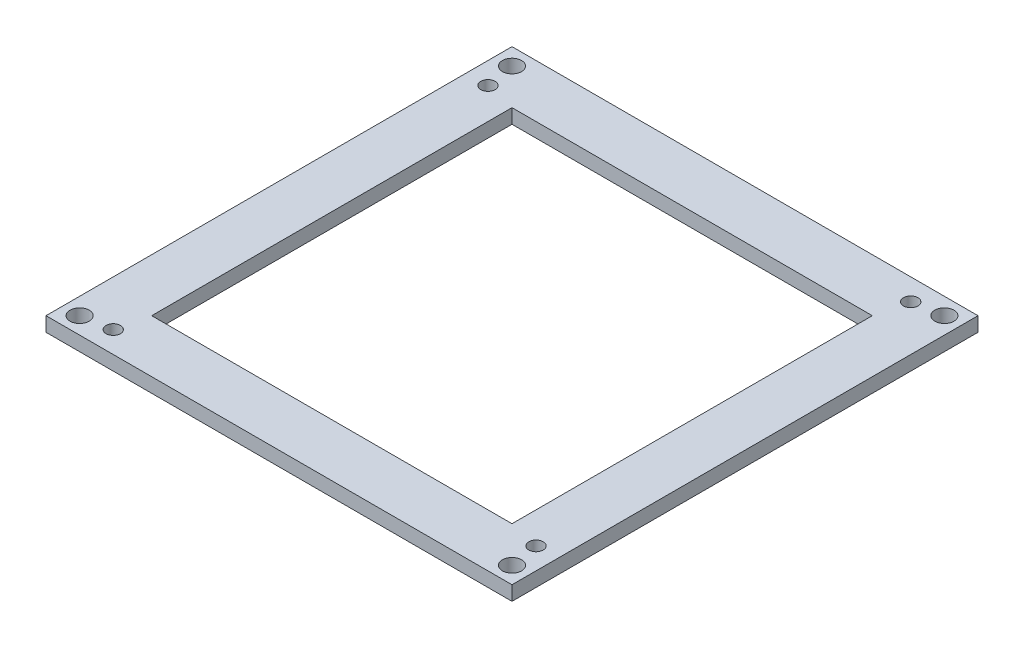
ISO-10303-21;
HEADER;
FILE_DESCRIPTION(('STEP AP214'),'2;1');
FILE_NAME('part.step','',(''),(''),'','','');
FILE_SCHEMA(('AUTOMOTIVE_DESIGN { 1 0 10303 214 1 1 1 1 }'));
ENDSEC;
DATA;
#1=APPLICATION_CONTEXT('core data for automotive mechanical design processes');
#2=APPLICATION_PROTOCOL_DEFINITION('international standard','automotive_design',2000,#1);
#3=PRODUCT_CONTEXT('',#1,'mechanical');
#4=PRODUCT('Part','Part','',(#3));
#5=PRODUCT_RELATED_PRODUCT_CATEGORY('part','',(#4));
#6=PRODUCT_DEFINITION_FORMATION('','',#4);
#7=PRODUCT_DEFINITION_CONTEXT('part definition',#1,'design');
#8=PRODUCT_DEFINITION('design','',#6,#7);
#9=PRODUCT_DEFINITION_SHAPE('','',#8);
#10=(LENGTH_UNIT() NAMED_UNIT(*) SI_UNIT(.MILLI.,.METRE.));
#11=(NAMED_UNIT(*) PLANE_ANGLE_UNIT() SI_UNIT($,.RADIAN.));
#12=(NAMED_UNIT(*) SI_UNIT($,.STERADIAN.) SOLID_ANGLE_UNIT());
#13=UNCERTAINTY_MEASURE_WITH_UNIT(LENGTH_MEASURE(1.E-05),#10,'distance_accuracy_value','');
#14=(GEOMETRIC_REPRESENTATION_CONTEXT(3) GLOBAL_UNCERTAINTY_ASSIGNED_CONTEXT((#13)) GLOBAL_UNIT_ASSIGNED_CONTEXT((#10,
#11,#12)) REPRESENTATION_CONTEXT('',''));
#15=CARTESIAN_POINT('',(0.,0.,0.));
#16=DIRECTION('',(0.,0.,1.));
#17=DIRECTION('',(1.,0.,0.));
#18=AXIS2_PLACEMENT_3D('',#15,#16,#17);
#19=CARTESIAN_POINT('',(0.,3.,0.));
#20=DIRECTION('',(1.,0.,0.));
#21=DIRECTION('',(0.,0.,-1.));
#22=AXIS2_PLACEMENT_3D('',#19,#20,#21);
#23=PLANE('',#22);
#24=DIRECTION('',(0.,0.,1.));
#25=VECTOR('',#24,1.);
#26=CARTESIAN_POINT('',(0.,0.,0.));
#27=LINE('',#26,#25);
#28=CARTESIAN_POINT('',(0.,0.,-97.));
#29=VERTEX_POINT('',#28);
#30=CARTESIAN_POINT('',(0.,0.,0.));
#31=VERTEX_POINT('',#30);
#32=EDGE_CURVE('E132',#29,#31,#27,.T.);
#33=ORIENTED_EDGE('',*,*,#32,.T.);
#34=DIRECTION('',(0.,-1.,0.));
#35=VECTOR('',#34,1.);
#36=CARTESIAN_POINT('',(0.,3.,0.));
#37=LINE('',#36,#35);
#38=CARTESIAN_POINT('',(0.,3.,0.));
#39=VERTEX_POINT('',#38);
#40=EDGE_CURVE('E179',#39,#31,#37,.T.);
#41=ORIENTED_EDGE('',*,*,#40,.F.);
#42=DIRECTION('',(0.,0.,1.));
#43=VECTOR('',#42,1.);
#44=CARTESIAN_POINT('',(0.,3.,0.));
#45=LINE('',#44,#43);
#46=CARTESIAN_POINT('',(0.,3.,-97.));
#47=VERTEX_POINT('',#46);
#48=EDGE_CURVE('E153',#47,#39,#45,.T.);
#49=ORIENTED_EDGE('',*,*,#48,.F.);
#50=DIRECTION('',(0.,-1.,0.));
#51=VECTOR('',#50,1.);
#52=CARTESIAN_POINT('',(0.,3.,-97.));
#53=LINE('',#52,#51);
#54=EDGE_CURVE('E163',#47,#29,#53,.T.);
#55=ORIENTED_EDGE('',*,*,#54,.T.);
#56=EDGE_LOOP('',(#33,#41,#49,#55));
#57=FACE_BOUND('',#56,.T.);
#58=ADVANCED_FACE('F35',(#57),#23,.F.);
#59=CARTESIAN_POINT('',(0.,3.,0.));
#60=DIRECTION('',(0.,0.,-1.));
#61=DIRECTION('',(-1.,0.,0.));
#62=AXIS2_PLACEMENT_3D('',#59,#60,#61);
#63=PLANE('',#62);
#64=DIRECTION('',(1.,0.,0.));
#65=VECTOR('',#64,1.);
#66=CARTESIAN_POINT('',(0.,0.,0.));
#67=LINE('',#66,#65);
#68=CARTESIAN_POINT('',(97.,0.,0.));
#69=VERTEX_POINT('',#68);
#70=EDGE_CURVE('E166',#31,#69,#67,.T.);
#71=ORIENTED_EDGE('',*,*,#70,.T.);
#72=DIRECTION('',(0.,-1.,0.));
#73=VECTOR('',#72,1.);
#74=CARTESIAN_POINT('',(97.,3.,0.));
#75=LINE('',#74,#73);
#76=CARTESIAN_POINT('',(97.,3.,0.));
#77=VERTEX_POINT('',#76);
#78=EDGE_CURVE('E176',#77,#69,#75,.T.);
#79=ORIENTED_EDGE('',*,*,#78,.F.);
#80=DIRECTION('',(1.,0.,0.));
#81=VECTOR('',#80,1.);
#82=CARTESIAN_POINT('',(0.,3.,0.));
#83=LINE('',#82,#81);
#84=EDGE_CURVE('E156',#39,#77,#83,.T.);
#85=ORIENTED_EDGE('',*,*,#84,.F.);
#86=ORIENTED_EDGE('',*,*,#40,.T.);
#87=EDGE_LOOP('',(#71,#79,#85,#86));
#88=FACE_BOUND('',#87,.T.);
#89=ADVANCED_FACE('F237',(#88),#63,.F.);
#90=CARTESIAN_POINT('',(97.,3.,0.));
#91=DIRECTION('',(-1.,0.,0.));
#92=DIRECTION('',(0.,0.,1.));
#93=AXIS2_PLACEMENT_3D('',#90,#91,#92);
#94=PLANE('',#93);
#95=DIRECTION('',(0.,0.,-1.));
#96=VECTOR('',#95,1.);
#97=CARTESIAN_POINT('',(97.,0.,0.));
#98=LINE('',#97,#96);
#99=CARTESIAN_POINT('',(97.,0.,-97.));
#100=VERTEX_POINT('',#99);
#101=EDGE_CURVE('E168',#69,#100,#98,.T.);
#102=ORIENTED_EDGE('',*,*,#101,.T.);
#103=DIRECTION('',(0.,-1.,0.));
#104=VECTOR('',#103,1.);
#105=CARTESIAN_POINT('',(97.,3.,-97.));
#106=LINE('',#105,#104);
#107=CARTESIAN_POINT('',(97.,3.,-97.));
#108=VERTEX_POINT('',#107);
#109=EDGE_CURVE('E173',#108,#100,#106,.T.);
#110=ORIENTED_EDGE('',*,*,#109,.F.);
#111=DIRECTION('',(0.,0.,-1.));
#112=VECTOR('',#111,1.);
#113=CARTESIAN_POINT('',(97.,3.,0.));
#114=LINE('',#113,#112);
#115=EDGE_CURVE('E159',#77,#108,#114,.T.);
#116=ORIENTED_EDGE('',*,*,#115,.F.);
#117=ORIENTED_EDGE('',*,*,#78,.T.);
#118=EDGE_LOOP('',(#102,#110,#116,#117));
#119=FACE_BOUND('',#118,.T.);
#120=ADVANCED_FACE('F242',(#119),#94,.F.);
#121=CARTESIAN_POINT('',(0.,3.,-97.));
#122=DIRECTION('',(0.,0.,1.));
#123=DIRECTION('',(1.,0.,0.));
#124=AXIS2_PLACEMENT_3D('',#121,#122,#123);
#125=PLANE('',#124);
#126=DIRECTION('',(-1.,0.,0.));
#127=VECTOR('',#126,1.);
#128=CARTESIAN_POINT('',(0.,0.,-97.));
#129=LINE('',#128,#127);
#130=EDGE_CURVE('E157',#100,#29,#129,.T.);
#131=ORIENTED_EDGE('',*,*,#130,.T.);
#132=ORIENTED_EDGE('',*,*,#54,.F.);
#133=DIRECTION('',(-1.,0.,0.));
#134=VECTOR('',#133,1.);
#135=CARTESIAN_POINT('',(0.,3.,-97.));
#136=LINE('',#135,#134);
#137=EDGE_CURVE('E161',#108,#47,#136,.T.);
#138=ORIENTED_EDGE('',*,*,#137,.F.);
#139=ORIENTED_EDGE('',*,*,#109,.T.);
#140=EDGE_LOOP('',(#131,#132,#138,#139));
#141=FACE_BOUND('',#140,.T.);
#142=ADVANCED_FACE('F217',(#141),#125,.F.);
#143=CARTESIAN_POINT('',(0.,3.,0.));
#144=DIRECTION('',(0.,-1.,0.));
#145=DIRECTION('',(0.,0.,-1.));
#146=AXIS2_PLACEMENT_3D('',#143,#144,#145);
#147=PLANE('',#146);
#148=CARTESIAN_POINT('',(3.5,3.,-3.49999999999999));
#149=DIRECTION('',(0.,1.,0.));
#150=DIRECTION('',(0.,0.,1.));
#151=AXIS2_PLACEMENT_3D('',#148,#149,#150);
#152=CIRCLE('',#151,2.);
#153=CARTESIAN_POINT('',(3.5,3.,-1.49999999999999));
#154=VERTEX_POINT('',#153);
#155=EDGE_CURVE('E203',#154,#154,#152,.T.);
#156=ORIENTED_EDGE('',*,*,#155,.F.);
#157=EDGE_LOOP('',(#156));
#158=FACE_BOUND('',#157,.T.);
#159=CARTESIAN_POINT('',(3.5,3.,-93.5));
#160=DIRECTION('',(0.,1.,0.));
#161=DIRECTION('',(0.,0.,1.));
#162=AXIS2_PLACEMENT_3D('',#159,#160,#161);
#163=CIRCLE('',#162,2.);
#164=CARTESIAN_POINT('',(3.5,3.,-91.5));
#165=VERTEX_POINT('',#164);
#166=EDGE_CURVE('E206',#165,#165,#163,.T.);
#167=ORIENTED_EDGE('',*,*,#166,.F.);
#168=EDGE_LOOP('',(#167));
#169=FACE_BOUND('',#168,.T.);
#170=CARTESIAN_POINT('',(93.5,3.,-93.5));
#171=DIRECTION('',(0.,1.,0.));
#172=DIRECTION('',(0.,0.,1.));
#173=AXIS2_PLACEMENT_3D('',#170,#171,#172);
#174=CIRCLE('',#173,2.);
#175=CARTESIAN_POINT('',(93.5,3.,-91.5));
#176=VERTEX_POINT('',#175);
#177=EDGE_CURVE('E202',#176,#176,#174,.T.);
#178=ORIENTED_EDGE('',*,*,#177,.F.);
#179=EDGE_LOOP('',(#178));
#180=FACE_BOUND('',#179,.T.);
#181=CARTESIAN_POINT('',(93.5,3.,-3.49999999999999));
#182=DIRECTION('',(0.,1.,0.));
#183=DIRECTION('',(0.,0.,1.));
#184=AXIS2_PLACEMENT_3D('',#181,#182,#183);
#185=CIRCLE('',#184,2.);
#186=CARTESIAN_POINT('',(93.5,3.,-1.49999999999999));
#187=VERTEX_POINT('',#186);
#188=EDGE_CURVE('E190',#187,#187,#185,.T.);
#189=ORIENTED_EDGE('',*,*,#188,.F.);
#190=EDGE_LOOP('',(#189));
#191=FACE_BOUND('',#190,.T.);
#192=DIRECTION('',(-1.,0.,0.));
#193=VECTOR('',#192,1.);
#194=CARTESIAN_POINT('',(11.,3.,-86.));
#195=LINE('',#194,#193);
#196=CARTESIAN_POINT('',(86.,3.,-86.));
#197=VERTEX_POINT('',#196);
#198=CARTESIAN_POINT('',(11.,3.,-86.));
#199=VERTEX_POINT('',#198);
#200=EDGE_CURVE('E112',#197,#199,#195,.T.);
#201=ORIENTED_EDGE('',*,*,#200,.F.);
#202=DIRECTION('',(0.,0.,-1.));
#203=VECTOR('',#202,1.);
#204=CARTESIAN_POINT('',(86.,3.,-11.));
#205=LINE('',#204,#203);
#206=CARTESIAN_POINT('',(86.,3.,-11.));
#207=VERTEX_POINT('',#206);
#208=EDGE_CURVE('E51',#207,#197,#205,.T.);
#209=ORIENTED_EDGE('',*,*,#208,.F.);
#210=DIRECTION('',(1.,0.,0.));
#211=VECTOR('',#210,1.);
#212=CARTESIAN_POINT('',(11.,3.,-11.));
#213=LINE('',#212,#211);
#214=CARTESIAN_POINT('',(11.,3.,-11.));
#215=VERTEX_POINT('',#214);
#216=EDGE_CURVE('E119',#215,#207,#213,.T.);
#217=ORIENTED_EDGE('',*,*,#216,.F.);
#218=DIRECTION('',(0.,0.,1.));
#219=VECTOR('',#218,1.);
#220=CARTESIAN_POINT('',(11.,3.,-11.));
#221=LINE('',#220,#219);
#222=EDGE_CURVE('E103',#199,#215,#221,.T.);
#223=ORIENTED_EDGE('',*,*,#222,.F.);
#224=EDGE_LOOP('',(#201,#209,#217,#223));
#225=FACE_BOUND('',#224,.T.);
#226=CARTESIAN_POINT('',(4.49999999999991,3.,-87.4999999999999));
#227=DIRECTION('',(0.,1.,0.));
#228=DIRECTION('',(0.,0.,1.));
#229=AXIS2_PLACEMENT_3D('',#226,#227,#228);
#230=CIRCLE('',#229,1.50000000000012);
#231=CARTESIAN_POINT('',(4.49999999999991,3.,-85.9999999999998));
#232=VERTEX_POINT('',#231);
#233=EDGE_CURVE('E133',#232,#232,#230,.T.);
#234=ORIENTED_EDGE('',*,*,#233,.F.);
#235=EDGE_LOOP('',(#234));
#236=FACE_BOUND('',#235,.T.);
#237=CARTESIAN_POINT('',(87.5000000000001,3.,-92.5000000000001));
#238=DIRECTION('',(0.,1.,0.));
#239=DIRECTION('',(0.,0.,1.));
#240=AXIS2_PLACEMENT_3D('',#237,#238,#239);
#241=CIRCLE('',#240,1.5);
#242=CARTESIAN_POINT('',(87.5000000000001,3.,-91.0000000000001));
#243=VERTEX_POINT('',#242);
#244=EDGE_CURVE('E136',#243,#243,#241,.T.);
#245=ORIENTED_EDGE('',*,*,#244,.F.);
#246=EDGE_LOOP('',(#245));
#247=FACE_BOUND('',#246,.T.);
#248=CARTESIAN_POINT('',(9.50000000000017,3.,-4.50000000000008));
#249=DIRECTION('',(0.,1.,0.));
#250=DIRECTION('',(0.,0.,1.));
#251=AXIS2_PLACEMENT_3D('',#248,#249,#250);
#252=CIRCLE('',#251,1.5);
#253=CARTESIAN_POINT('',(9.50000000000017,3.,-3.00000000000008));
#254=VERTEX_POINT('',#253);
#255=EDGE_CURVE('E142',#254,#254,#252,.T.);
#256=ORIENTED_EDGE('',*,*,#255,.F.);
#257=EDGE_LOOP('',(#256));
#258=FACE_BOUND('',#257,.T.);
#259=CARTESIAN_POINT('',(92.5000000000013,3.,-9.49999999999898));
#260=DIRECTION('',(0.,1.,0.));
#261=DIRECTION('',(0.,0.,1.));
#262=AXIS2_PLACEMENT_3D('',#259,#260,#261);
#263=CIRCLE('',#262,1.5);
#264=CARTESIAN_POINT('',(92.5000000000013,3.,-7.99999999999898));
#265=VERTEX_POINT('',#264);
#266=EDGE_CURVE('E148',#265,#265,#263,.T.);
#267=ORIENTED_EDGE('',*,*,#266,.F.);
#268=EDGE_LOOP('',(#267));
#269=FACE_BOUND('',#268,.T.);
#270=ORIENTED_EDGE('',*,*,#48,.T.);
#271=ORIENTED_EDGE('',*,*,#84,.T.);
#272=ORIENTED_EDGE('',*,*,#115,.T.);
#273=ORIENTED_EDGE('',*,*,#137,.T.);
#274=EDGE_LOOP('',(#270,#271,#272,#273));
#275=FACE_BOUND('',#274,.T.);
#276=ADVANCED_FACE('F116',(#158,#169,#180,#191,#225,#236,#247,#258,#269,#275),#147,.F.);
#277=CARTESIAN_POINT('',(0.,0.,0.));
#278=DIRECTION('',(0.,-1.,0.));
#279=DIRECTION('',(0.,0.,-1.));
#280=AXIS2_PLACEMENT_3D('',#277,#278,#279);
#281=PLANE('',#280);
#282=CARTESIAN_POINT('',(3.5,0.,-3.49999999999999));
#283=DIRECTION('',(0.,-1.,0.));
#284=DIRECTION('',(0.,0.,-1.));
#285=AXIS2_PLACEMENT_3D('',#282,#283,#284);
#286=CIRCLE('',#285,2.);
#287=CARTESIAN_POINT('',(3.5,0.,-5.49999999999999));
#288=VERTEX_POINT('',#287);
#289=EDGE_CURVE('E38',#288,#288,#286,.T.);
#290=ORIENTED_EDGE('',*,*,#289,.F.);
#291=EDGE_LOOP('',(#290));
#292=FACE_BOUND('',#291,.T.);
#293=CARTESIAN_POINT('',(3.5,0.,-93.5));
#294=DIRECTION('',(0.,-1.,0.));
#295=DIRECTION('',(0.,0.,-1.));
#296=AXIS2_PLACEMENT_3D('',#293,#294,#295);
#297=CIRCLE('',#296,2.);
#298=CARTESIAN_POINT('',(3.5,0.,-95.5));
#299=VERTEX_POINT('',#298);
#300=EDGE_CURVE('E192',#299,#299,#297,.T.);
#301=ORIENTED_EDGE('',*,*,#300,.F.);
#302=EDGE_LOOP('',(#301));
#303=FACE_BOUND('',#302,.T.);
#304=CARTESIAN_POINT('',(93.5,0.,-93.5));
#305=DIRECTION('',(0.,-1.,0.));
#306=DIRECTION('',(0.,0.,-1.));
#307=AXIS2_PLACEMENT_3D('',#304,#305,#306);
#308=CIRCLE('',#307,2.);
#309=CARTESIAN_POINT('',(93.5,0.,-95.5));
#310=VERTEX_POINT('',#309);
#311=EDGE_CURVE('E189',#310,#310,#308,.T.);
#312=ORIENTED_EDGE('',*,*,#311,.F.);
#313=EDGE_LOOP('',(#312));
#314=FACE_BOUND('',#313,.T.);
#315=CARTESIAN_POINT('',(93.5,0.,-3.49999999999999));
#316=DIRECTION('',(0.,-1.,0.));
#317=DIRECTION('',(0.,0.,-1.));
#318=AXIS2_PLACEMENT_3D('',#315,#316,#317);
#319=CIRCLE('',#318,2.);
#320=CARTESIAN_POINT('',(93.5,0.,-5.49999999999998));
#321=VERTEX_POINT('',#320);
#322=EDGE_CURVE('E186',#321,#321,#319,.T.);
#323=ORIENTED_EDGE('',*,*,#322,.F.);
#324=EDGE_LOOP('',(#323));
#325=FACE_BOUND('',#324,.T.);
#326=DIRECTION('',(0.,0.,1.));
#327=VECTOR('',#326,1.);
#328=CARTESIAN_POINT('',(86.,0.,0.));
#329=LINE('',#328,#327);
#330=CARTESIAN_POINT('',(86.,0.,-86.));
#331=VERTEX_POINT('',#330);
#332=CARTESIAN_POINT('',(86.,0.,-11.));
#333=VERTEX_POINT('',#332);
#334=EDGE_CURVE('E11',#331,#333,#329,.T.);
#335=ORIENTED_EDGE('',*,*,#334,.F.);
#336=DIRECTION('',(1.,0.,0.));
#337=VECTOR('',#336,1.);
#338=CARTESIAN_POINT('',(0.,0.,-86.));
#339=LINE('',#338,#337);
#340=CARTESIAN_POINT('',(11.,0.,-86.));
#341=VERTEX_POINT('',#340);
#342=EDGE_CURVE('E182',#341,#331,#339,.T.);
#343=ORIENTED_EDGE('',*,*,#342,.F.);
#344=DIRECTION('',(0.,0.,-1.));
#345=VECTOR('',#344,1.);
#346=CARTESIAN_POINT('',(11.,0.,0.));
#347=LINE('',#346,#345);
#348=CARTESIAN_POINT('',(11.,0.,-11.));
#349=VERTEX_POINT('',#348);
#350=EDGE_CURVE('E106',#349,#341,#347,.T.);
#351=ORIENTED_EDGE('',*,*,#350,.F.);
#352=DIRECTION('',(-1.,0.,0.));
#353=VECTOR('',#352,1.);
#354=CARTESIAN_POINT('',(0.,0.,-11.));
#355=LINE('',#354,#353);
#356=EDGE_CURVE('E43',#333,#349,#355,.T.);
#357=ORIENTED_EDGE('',*,*,#356,.F.);
#358=EDGE_LOOP('',(#335,#343,#351,#357));
#359=FACE_BOUND('',#358,.T.);
#360=CARTESIAN_POINT('',(4.49999999999991,0.,-87.4999999999999));
#361=DIRECTION('',(0.,1.,0.));
#362=DIRECTION('',(0.,0.,1.));
#363=AXIS2_PLACEMENT_3D('',#360,#361,#362);
#364=CIRCLE('',#363,1.50000000000012);
#365=CARTESIAN_POINT('',(4.49999999999991,0.,-85.9999999999998));
#366=VERTEX_POINT('',#365);
#367=EDGE_CURVE('E129',#366,#366,#364,.T.);
#368=ORIENTED_EDGE('',*,*,#367,.T.);
#369=EDGE_LOOP('',(#368));
#370=FACE_BOUND('',#369,.T.);
#371=CARTESIAN_POINT('',(87.5000000000001,0.,-92.5000000000001));
#372=DIRECTION('',(0.,1.,0.));
#373=DIRECTION('',(0.,0.,1.));
#374=AXIS2_PLACEMENT_3D('',#371,#372,#373);
#375=CIRCLE('',#374,1.5);
#376=CARTESIAN_POINT('',(87.5000000000001,0.,-91.0000000000001));
#377=VERTEX_POINT('',#376);
#378=EDGE_CURVE('E139',#377,#377,#375,.T.);
#379=ORIENTED_EDGE('',*,*,#378,.T.);
#380=EDGE_LOOP('',(#379));
#381=FACE_BOUND('',#380,.T.);
#382=CARTESIAN_POINT('',(9.50000000000017,0.,-4.50000000000008));
#383=DIRECTION('',(0.,1.,0.));
#384=DIRECTION('',(0.,0.,1.));
#385=AXIS2_PLACEMENT_3D('',#382,#383,#384);
#386=CIRCLE('',#385,1.5);
#387=CARTESIAN_POINT('',(9.50000000000017,0.,-3.00000000000008));
#388=VERTEX_POINT('',#387);
#389=EDGE_CURVE('E145',#388,#388,#386,.T.);
#390=ORIENTED_EDGE('',*,*,#389,.T.);
#391=EDGE_LOOP('',(#390));
#392=FACE_BOUND('',#391,.T.);
#393=CARTESIAN_POINT('',(92.5000000000013,0.,-9.49999999999898));
#394=DIRECTION('',(0.,1.,0.));
#395=DIRECTION('',(0.,0.,1.));
#396=AXIS2_PLACEMENT_3D('',#393,#394,#395);
#397=CIRCLE('',#396,1.5);
#398=CARTESIAN_POINT('',(92.5000000000013,0.,-7.99999999999898));
#399=VERTEX_POINT('',#398);
#400=EDGE_CURVE('E126',#399,#399,#397,.T.);
#401=ORIENTED_EDGE('',*,*,#400,.T.);
#402=EDGE_LOOP('',(#401));
#403=FACE_BOUND('',#402,.T.);
#404=ORIENTED_EDGE('',*,*,#32,.F.);
#405=ORIENTED_EDGE('',*,*,#130,.F.);
#406=ORIENTED_EDGE('',*,*,#101,.F.);
#407=ORIENTED_EDGE('',*,*,#70,.F.);
#408=EDGE_LOOP('',(#404,#405,#406,#407));
#409=FACE_BOUND('',#408,.T.);
#410=ADVANCED_FACE('F216',(#292,#303,#314,#325,#359,#370,#381,#392,#403,#409),#281,.T.);
#411=CARTESIAN_POINT('',(92.5000000000013,0.,-9.49999999999898));
#412=DIRECTION('',(0.,1.,0.));
#413=DIRECTION('',(0.,0.,1.));
#414=AXIS2_PLACEMENT_3D('',#411,#412,#413);
#415=CYLINDRICAL_SURFACE('',#414,1.5);
#416=ORIENTED_EDGE('',*,*,#400,.F.);
#417=EDGE_LOOP('',(#416));
#418=FACE_BOUND('',#417,.T.);
#419=ORIENTED_EDGE('',*,*,#266,.T.);
#420=EDGE_LOOP('',(#419));
#421=FACE_BOUND('',#420,.T.);
#422=ADVANCED_FACE('F266',(#418,#421),#415,.F.);
#423=CARTESIAN_POINT('',(9.50000000000017,0.,-4.50000000000008));
#424=DIRECTION('',(0.,1.,0.));
#425=DIRECTION('',(0.,0.,1.));
#426=AXIS2_PLACEMENT_3D('',#423,#424,#425);
#427=CYLINDRICAL_SURFACE('',#426,1.5);
#428=ORIENTED_EDGE('',*,*,#389,.F.);
#429=EDGE_LOOP('',(#428));
#430=FACE_BOUND('',#429,.T.);
#431=ORIENTED_EDGE('',*,*,#255,.T.);
#432=EDGE_LOOP('',(#431));
#433=FACE_BOUND('',#432,.T.);
#434=ADVANCED_FACE('F271',(#430,#433),#427,.F.);
#435=CARTESIAN_POINT('',(87.5000000000001,0.,-92.5000000000001));
#436=DIRECTION('',(0.,1.,0.));
#437=DIRECTION('',(0.,0.,1.));
#438=AXIS2_PLACEMENT_3D('',#435,#436,#437);
#439=CYLINDRICAL_SURFACE('',#438,1.5);
#440=ORIENTED_EDGE('',*,*,#378,.F.);
#441=EDGE_LOOP('',(#440));
#442=FACE_BOUND('',#441,.T.);
#443=ORIENTED_EDGE('',*,*,#244,.T.);
#444=EDGE_LOOP('',(#443));
#445=FACE_BOUND('',#444,.T.);
#446=ADVANCED_FACE('F275',(#442,#445),#439,.F.);
#447=CARTESIAN_POINT('',(4.49999999999991,0.,-87.4999999999999));
#448=DIRECTION('',(0.,1.,0.));
#449=DIRECTION('',(0.,0.,1.));
#450=AXIS2_PLACEMENT_3D('',#447,#448,#449);
#451=CYLINDRICAL_SURFACE('',#450,1.50000000000012);
#452=ORIENTED_EDGE('',*,*,#367,.F.);
#453=EDGE_LOOP('',(#452));
#454=FACE_BOUND('',#453,.T.);
#455=ORIENTED_EDGE('',*,*,#233,.T.);
#456=EDGE_LOOP('',(#455));
#457=FACE_BOUND('',#456,.T.);
#458=ADVANCED_FACE('F279',(#454,#457),#451,.F.);
#459=CARTESIAN_POINT('',(86.,-4.,-11.));
#460=DIRECTION('',(1.,0.,0.));
#461=DIRECTION('',(0.,0.,-1.));
#462=AXIS2_PLACEMENT_3D('',#459,#460,#461);
#463=PLANE('',#462);
#464=ORIENTED_EDGE('',*,*,#334,.T.);
#465=DIRECTION('',(0.,1.,0.));
#466=VECTOR('',#465,1.);
#467=CARTESIAN_POINT('',(86.,-4.,-11.));
#468=LINE('',#467,#466);
#469=EDGE_CURVE('E124',#333,#207,#468,.T.);
#470=ORIENTED_EDGE('',*,*,#469,.T.);
#471=ORIENTED_EDGE('',*,*,#208,.T.);
#472=DIRECTION('',(0.,1.,0.));
#473=VECTOR('',#472,1.);
#474=CARTESIAN_POINT('',(86.,-4.,-86.));
#475=LINE('',#474,#473);
#476=EDGE_CURVE('E109',#331,#197,#475,.T.);
#477=ORIENTED_EDGE('',*,*,#476,.F.);
#478=EDGE_LOOP('',(#464,#470,#471,#477));
#479=FACE_BOUND('',#478,.T.);
#480=ADVANCED_FACE('F283',(#479),#463,.F.);
#481=CARTESIAN_POINT('',(11.,-4.,-11.));
#482=DIRECTION('',(0.,0.,1.));
#483=DIRECTION('',(1.,0.,0.));
#484=AXIS2_PLACEMENT_3D('',#481,#482,#483);
#485=PLANE('',#484);
#486=ORIENTED_EDGE('',*,*,#356,.T.);
#487=DIRECTION('',(0.,1.,0.));
#488=VECTOR('',#487,1.);
#489=CARTESIAN_POINT('',(11.,-4.,-11.));
#490=LINE('',#489,#488);
#491=EDGE_CURVE('E108',#349,#215,#490,.T.);
#492=ORIENTED_EDGE('',*,*,#491,.T.);
#493=ORIENTED_EDGE('',*,*,#216,.T.);
#494=ORIENTED_EDGE('',*,*,#469,.F.);
#495=EDGE_LOOP('',(#486,#492,#493,#494));
#496=FACE_BOUND('',#495,.T.);
#497=ADVANCED_FACE('F286',(#496),#485,.F.);
#498=CARTESIAN_POINT('',(11.,-4.,-11.));
#499=DIRECTION('',(-1.,0.,0.));
#500=DIRECTION('',(0.,0.,1.));
#501=AXIS2_PLACEMENT_3D('',#498,#499,#500);
#502=PLANE('',#501);
#503=ORIENTED_EDGE('',*,*,#350,.T.);
#504=DIRECTION('',(0.,1.,0.));
#505=VECTOR('',#504,1.);
#506=CARTESIAN_POINT('',(11.,-4.,-86.));
#507=LINE('',#506,#505);
#508=EDGE_CURVE('E59',#341,#199,#507,.T.);
#509=ORIENTED_EDGE('',*,*,#508,.T.);
#510=ORIENTED_EDGE('',*,*,#222,.T.);
#511=ORIENTED_EDGE('',*,*,#491,.F.);
#512=EDGE_LOOP('',(#503,#509,#510,#511));
#513=FACE_BOUND('',#512,.T.);
#514=ADVANCED_FACE('F100',(#513),#502,.F.);
#515=CARTESIAN_POINT('',(11.,-4.,-86.));
#516=DIRECTION('',(0.,0.,-1.));
#517=DIRECTION('',(-1.,0.,0.));
#518=AXIS2_PLACEMENT_3D('',#515,#516,#517);
#519=PLANE('',#518);
#520=ORIENTED_EDGE('',*,*,#342,.T.);
#521=ORIENTED_EDGE('',*,*,#476,.T.);
#522=ORIENTED_EDGE('',*,*,#200,.T.);
#523=ORIENTED_EDGE('',*,*,#508,.F.);
#524=EDGE_LOOP('',(#520,#521,#522,#523));
#525=FACE_BOUND('',#524,.T.);
#526=ADVANCED_FACE('F113',(#525),#519,.F.);
#527=CARTESIAN_POINT('',(93.5,-7.,-3.49999999999999));
#528=DIRECTION('',(0.,1.,0.));
#529=DIRECTION('',(0.,0.,1.));
#530=AXIS2_PLACEMENT_3D('',#527,#528,#529);
#531=CYLINDRICAL_SURFACE('',#530,2.);
#532=ORIENTED_EDGE('',*,*,#322,.T.);
#533=EDGE_LOOP('',(#532));
#534=FACE_BOUND('',#533,.T.);
#535=ORIENTED_EDGE('',*,*,#188,.T.);
#536=EDGE_LOOP('',(#535));
#537=FACE_BOUND('',#536,.T.);
#538=ADVANCED_FACE('F222',(#534,#537),#531,.F.);
#539=CARTESIAN_POINT('',(93.5,-7.,-93.5));
#540=DIRECTION('',(0.,1.,0.));
#541=DIRECTION('',(0.,0.,1.));
#542=AXIS2_PLACEMENT_3D('',#539,#540,#541);
#543=CYLINDRICAL_SURFACE('',#542,2.);
#544=ORIENTED_EDGE('',*,*,#311,.T.);
#545=EDGE_LOOP('',(#544));
#546=FACE_BOUND('',#545,.T.);
#547=ORIENTED_EDGE('',*,*,#177,.T.);
#548=EDGE_LOOP('',(#547));
#549=FACE_BOUND('',#548,.T.);
#550=ADVANCED_FACE('F212',(#546,#549),#543,.F.);
#551=CARTESIAN_POINT('',(3.5,-7.,-93.5));
#552=DIRECTION('',(0.,1.,0.));
#553=DIRECTION('',(0.,0.,1.));
#554=AXIS2_PLACEMENT_3D('',#551,#552,#553);
#555=CYLINDRICAL_SURFACE('',#554,2.);
#556=ORIENTED_EDGE('',*,*,#300,.T.);
#557=EDGE_LOOP('',(#556));
#558=FACE_BOUND('',#557,.T.);
#559=ORIENTED_EDGE('',*,*,#166,.T.);
#560=EDGE_LOOP('',(#559));
#561=FACE_BOUND('',#560,.T.);
#562=ADVANCED_FACE('F230',(#558,#561),#555,.F.);
#563=CARTESIAN_POINT('',(3.5,-7.,-3.49999999999999));
#564=DIRECTION('',(0.,1.,0.));
#565=DIRECTION('',(0.,0.,1.));
#566=AXIS2_PLACEMENT_3D('',#563,#564,#565);
#567=CYLINDRICAL_SURFACE('',#566,2.);
#568=ORIENTED_EDGE('',*,*,#289,.T.);
#569=EDGE_LOOP('',(#568));
#570=FACE_BOUND('',#569,.T.);
#571=ORIENTED_EDGE('',*,*,#155,.T.);
#572=EDGE_LOOP('',(#571));
#573=FACE_BOUND('',#572,.T.);
#574=ADVANCED_FACE('F359',(#570,#573),#567,.F.);
#575=CLOSED_SHELL('',(#58,#89,#120,#142,#276,#410,#422,#434,#446,#458,#480,#497,#514,#526,#538,
#550,#562,#574));
#576=MANIFOLD_SOLID_BREP('B2',#575);
#577=ADVANCED_BREP_SHAPE_REPRESENTATION('',(#18,#576),#14);
#578=SHAPE_DEFINITION_REPRESENTATION(#9,#577);
ENDSEC;
END-ISO-10303-21;
